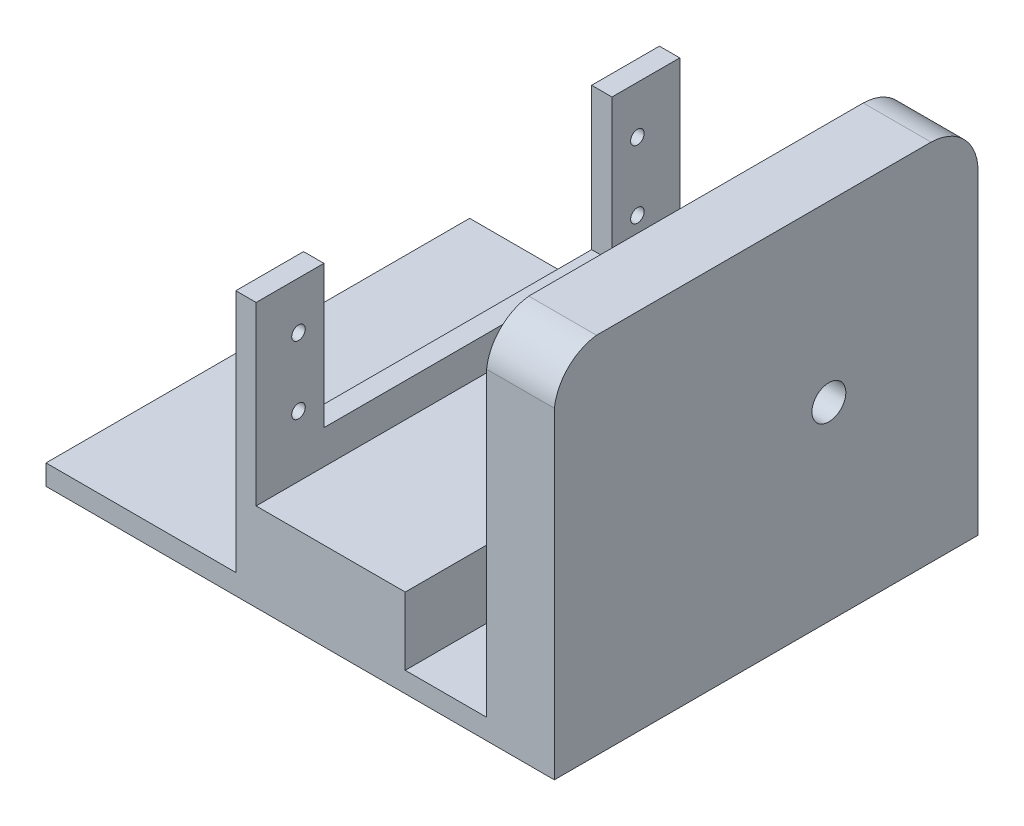
ISO-10303-21;
HEADER;
FILE_DESCRIPTION(('STEP AP214'),'2;1');
FILE_NAME('part.step','',(''),(''),'','','');
FILE_SCHEMA(('AUTOMOTIVE_DESIGN { 1 0 10303 214 1 1 1 1 }'));
ENDSEC;
DATA;
#1=APPLICATION_CONTEXT('core data for automotive mechanical design processes');
#2=APPLICATION_PROTOCOL_DEFINITION('international standard','automotive_design',2000,#1);
#3=PRODUCT_CONTEXT('',#1,'mechanical');
#4=PRODUCT('Part','Part','',(#3));
#5=PRODUCT_RELATED_PRODUCT_CATEGORY('part','',(#4));
#6=PRODUCT_DEFINITION_FORMATION('','',#4);
#7=PRODUCT_DEFINITION_CONTEXT('part definition',#1,'design');
#8=PRODUCT_DEFINITION('design','',#6,#7);
#9=PRODUCT_DEFINITION_SHAPE('','',#8);
#10=(LENGTH_UNIT() NAMED_UNIT(*) SI_UNIT(.MILLI.,.METRE.));
#11=(NAMED_UNIT(*) PLANE_ANGLE_UNIT() SI_UNIT($,.RADIAN.));
#12=(NAMED_UNIT(*) SI_UNIT($,.STERADIAN.) SOLID_ANGLE_UNIT());
#13=UNCERTAINTY_MEASURE_WITH_UNIT(LENGTH_MEASURE(1.E-05),#10,'distance_accuracy_value','');
#14=(GEOMETRIC_REPRESENTATION_CONTEXT(3) GLOBAL_UNCERTAINTY_ASSIGNED_CONTEXT((#13)) GLOBAL_UNIT_ASSIGNED_CONTEXT((#10,
#11,#12)) REPRESENTATION_CONTEXT('',''));
#15=CARTESIAN_POINT('',(0.,0.,0.));
#16=DIRECTION('',(0.,0.,1.));
#17=DIRECTION('',(1.,0.,0.));
#18=AXIS2_PLACEMENT_3D('',#15,#16,#17);
#19=CARTESIAN_POINT('',(99.,53.7,0.));
#20=DIRECTION('',(-1.,0.,0.));
#21=DIRECTION('',(0.,0.,1.));
#22=AXIS2_PLACEMENT_3D('',#19,#20,#21);
#23=PLANE('',#22);
#24=CARTESIAN_POINT('',(99.,28.,-40.5));
#25=DIRECTION('',(1.,0.,0.));
#26=DIRECTION('',(0.,0.,-1.));
#27=AXIS2_PLACEMENT_3D('',#24,#25,#26);
#28=CIRCLE('',#27,2.5);
#29=CARTESIAN_POINT('',(99.,28.,-43.));
#30=VERTEX_POINT('',#29);
#31=EDGE_CURVE('E189',#30,#30,#28,.T.);
#32=ORIENTED_EDGE('',*,*,#31,.F.);
#33=EDGE_LOOP('',(#32));
#34=FACE_BOUND('',#33,.T.);
#35=DIRECTION('',(0.,0.,-1.));
#36=VECTOR('',#35,1.);
#37=CARTESIAN_POINT('',(99.,53.7,0.));
#38=LINE('',#37,#36);
#39=CARTESIAN_POINT('',(99.,53.7,-6.2188127706575));
#40=VERTEX_POINT('',#39);
#41=CARTESIAN_POINT('',(99.,53.7,-55.5690833949978));
#42=VERTEX_POINT('',#41);
#43=EDGE_CURVE('E174',#40,#42,#38,.T.);
#44=ORIENTED_EDGE('',*,*,#43,.F.);
#45=CARTESIAN_POINT('',(99.,46.6229024406769,-7.07709755932307));
#46=DIRECTION('',(1.,0.,0.));
#47=DIRECTION('',(0.,0.,-1.));
#48=AXIS2_PLACEMENT_3D('',#45,#46,#47);
#49=CIRCLE('',#48,7.12895242252543);
#50=CARTESIAN_POINT('',(99.,47.4811872293424,0.));
#51=VERTEX_POINT('',#50);
#52=EDGE_CURVE('E161',#51,#40,#49,.F.);
#53=ORIENTED_EDGE('',*,*,#52,.F.);
#54=DIRECTION('',(0.,-1.,0.));
#55=VECTOR('',#54,1.);
#56=CARTESIAN_POINT('',(99.,53.7,0.));
#57=LINE('',#56,#55);
#58=CARTESIAN_POINT('',(99.,0.,0.));
#59=VERTEX_POINT('',#58);
#60=EDGE_CURVE('E170',#51,#59,#57,.T.);
#61=ORIENTED_EDGE('',*,*,#60,.T.);
#62=DIRECTION('',(0.,0.,-1.));
#63=VECTOR('',#62,1.);
#64=CARTESIAN_POINT('',(99.,0.,0.));
#65=LINE('',#64,#63);
#66=CARTESIAN_POINT('',(99.,0.,-62.5));
#67=VERTEX_POINT('',#66);
#68=EDGE_CURVE('E328',#59,#67,#65,.T.);
#69=ORIENTED_EDGE('',*,*,#68,.T.);
#70=DIRECTION('',(0.,-1.,0.));
#71=VECTOR('',#70,1.);
#72=CARTESIAN_POINT('',(99.,53.7,-62.5));
#73=LINE('',#72,#71);
#74=CARTESIAN_POINT('',(99.,46.6229024406769,-62.5));
#75=VERTEX_POINT('',#74);
#76=EDGE_CURVE('E181',#75,#67,#73,.T.);
#77=ORIENTED_EDGE('',*,*,#76,.F.);
#78=CARTESIAN_POINT('',(99.,46.6215697941753,-55.42000012542));
#79=DIRECTION('',(1.,0.,0.));
#80=DIRECTION('',(0.,0.,-1.));
#81=AXIS2_PLACEMENT_3D('',#78,#79,#80);
#82=CIRCLE('',#81,7.08);
#83=EDGE_CURVE('E175',#75,#42,#82,.T.);
#84=ORIENTED_EDGE('',*,*,#83,.T.);
#85=EDGE_LOOP('',(#44,#53,#61,#69,#77,#84));
#86=FACE_BOUND('',#85,.T.);
#87=ADVANCED_FACE('F36',(#34,#86),#23,.F.);
#88=CARTESIAN_POINT('',(0.,53.7,-62.5));
#89=DIRECTION('',(0.,-1.,0.));
#90=DIRECTION('',(0.,0.,-1.));
#91=AXIS2_PLACEMENT_3D('',#88,#89,#90);
#92=PLANE('',#91);
#93=DIRECTION('',(0.,0.,-1.));
#94=VECTOR('',#93,1.);
#95=CARTESIAN_POINT('',(89.,53.7,-62.5));
#96=LINE('',#95,#94);
#97=CARTESIAN_POINT('',(89.,53.7,-6.21881277065751));
#98=VERTEX_POINT('',#97);
#99=CARTESIAN_POINT('',(89.,53.7,-55.5690833949978));
#100=VERTEX_POINT('',#99);
#101=EDGE_CURVE('E308',#98,#100,#96,.T.);
#102=ORIENTED_EDGE('',*,*,#101,.F.);
#103=DIRECTION('',(1.,0.,0.));
#104=VECTOR('',#103,1.);
#105=CARTESIAN_POINT('',(49.,53.7,-6.2188127706575));
#106=LINE('',#105,#104);
#107=EDGE_CURVE('E59',#98,#40,#106,.T.);
#108=ORIENTED_EDGE('',*,*,#107,.T.);
#109=ORIENTED_EDGE('',*,*,#43,.T.);
#110=DIRECTION('',(1.,0.,0.));
#111=VECTOR('',#110,1.);
#112=CARTESIAN_POINT('',(49.,53.7,-55.5690833949978));
#113=LINE('',#112,#111);
#114=EDGE_CURVE('E376',#100,#42,#113,.T.);
#115=ORIENTED_EDGE('',*,*,#114,.F.);
#116=EDGE_LOOP('',(#102,#108,#109,#115));
#117=FACE_BOUND('',#116,.T.);
#118=ADVANCED_FACE('F378',(#117),#92,.F.);
#119=CARTESIAN_POINT('',(89.,3.,-62.5));
#120=DIRECTION('',(1.,0.,0.));
#121=DIRECTION('',(0.,0.,-1.));
#122=AXIS2_PLACEMENT_3D('',#119,#120,#121);
#123=PLANE('',#122);
#124=CARTESIAN_POINT('',(89.,28.,-40.5));
#125=DIRECTION('',(1.,0.,0.));
#126=DIRECTION('',(0.,0.,-1.));
#127=AXIS2_PLACEMENT_3D('',#124,#125,#126);
#128=CIRCLE('',#127,2.5);
#129=CARTESIAN_POINT('',(89.,28.,-43.));
#130=VERTEX_POINT('',#129);
#131=EDGE_CURVE('E186',#130,#130,#128,.T.);
#132=ORIENTED_EDGE('',*,*,#131,.T.);
#133=EDGE_LOOP('',(#132));
#134=FACE_BOUND('',#133,.T.);
#135=DIRECTION('',(0.,1.,0.));
#136=VECTOR('',#135,1.);
#137=CARTESIAN_POINT('',(89.,3.,0.));
#138=LINE('',#137,#136);
#139=CARTESIAN_POINT('',(89.,3.,0.));
#140=VERTEX_POINT('',#139);
#141=CARTESIAN_POINT('',(89.,47.4811872293424,0.));
#142=VERTEX_POINT('',#141);
#143=EDGE_CURVE('E318',#140,#142,#138,.T.);
#144=ORIENTED_EDGE('',*,*,#143,.T.);
#145=CARTESIAN_POINT('',(89.,46.6229024406769,-7.07709755932307));
#146=DIRECTION('',(1.,0.,0.));
#147=DIRECTION('',(0.,0.,-1.));
#148=AXIS2_PLACEMENT_3D('',#145,#146,#147);
#149=CIRCLE('',#148,7.12895242252543);
#150=EDGE_CURVE('E11',#142,#98,#149,.F.);
#151=ORIENTED_EDGE('',*,*,#150,.T.);
#152=ORIENTED_EDGE('',*,*,#101,.T.);
#153=CARTESIAN_POINT('',(89.,46.6215697941753,-55.42000012542));
#154=DIRECTION('',(1.,0.,0.));
#155=DIRECTION('',(0.,0.,-1.));
#156=AXIS2_PLACEMENT_3D('',#153,#154,#155);
#157=CIRCLE('',#156,7.08);
#158=CARTESIAN_POINT('',(89.,46.6229024406769,-62.5));
#159=VERTEX_POINT('',#158);
#160=EDGE_CURVE('E44',#159,#100,#157,.T.);
#161=ORIENTED_EDGE('',*,*,#160,.F.);
#162=DIRECTION('',(0.,1.,0.));
#163=VECTOR('',#162,1.);
#164=CARTESIAN_POINT('',(89.,3.,-62.5));
#165=LINE('',#164,#163);
#166=CARTESIAN_POINT('',(89.,3.,-62.5));
#167=VERTEX_POINT('',#166);
#168=EDGE_CURVE('E321',#167,#159,#165,.T.);
#169=ORIENTED_EDGE('',*,*,#168,.F.);
#170=DIRECTION('',(0.,0.,-1.));
#171=VECTOR('',#170,1.);
#172=CARTESIAN_POINT('',(89.,3.,-62.5));
#173=LINE('',#172,#171);
#174=EDGE_CURVE('E311',#140,#167,#173,.T.);
#175=ORIENTED_EDGE('',*,*,#174,.F.);
#176=EDGE_LOOP('',(#144,#151,#152,#161,#169,#175));
#177=FACE_BOUND('',#176,.T.);
#178=ADVANCED_FACE('F372',(#134,#177),#123,.F.);
#179=CARTESIAN_POINT('',(10.,3.,0.));
#180=DIRECTION('',(0.,1.,0.));
#181=DIRECTION('',(0.,0.,1.));
#182=AXIS2_PLACEMENT_3D('',#179,#180,#181);
#183=PLANE('',#182);
#184=DIRECTION('',(-1.,0.,0.));
#185=VECTOR('',#184,1.);
#186=CARTESIAN_POINT('',(9.99999999999999,3.,-62.5));
#187=LINE('',#186,#185);
#188=CARTESIAN_POINT('',(77.,3.,-62.5));
#189=VERTEX_POINT('',#188);
#190=EDGE_CURVE('E316',#167,#189,#187,.T.);
#191=ORIENTED_EDGE('',*,*,#190,.T.);
#192=DIRECTION('',(0.,0.,-1.));
#193=VECTOR('',#192,1.);
#194=CARTESIAN_POINT('',(77.,3.,-62.5));
#195=LINE('',#194,#193);
#196=CARTESIAN_POINT('',(77.,3.,0.));
#197=VERTEX_POINT('',#196);
#198=EDGE_CURVE('E273',#197,#189,#195,.T.);
#199=ORIENTED_EDGE('',*,*,#198,.F.);
#200=DIRECTION('',(1.,0.,0.));
#201=VECTOR('',#200,1.);
#202=CARTESIAN_POINT('',(10.,3.,0.));
#203=LINE('',#202,#201);
#204=EDGE_CURVE('E312',#197,#140,#203,.T.);
#205=ORIENTED_EDGE('',*,*,#204,.T.);
#206=ORIENTED_EDGE('',*,*,#174,.T.);
#207=EDGE_LOOP('',(#191,#199,#205,#206));
#208=FACE_BOUND('',#207,.T.);
#209=ADVANCED_FACE('F369',(#208),#183,.T.);
#210=DIRECTION('',(0.,0.,-1.));
#211=VECTOR('',#210,1.);
#212=CARTESIAN_POINT('',(24.,3.,0.));
#213=LINE('',#212,#211);
#214=CARTESIAN_POINT('',(24.,3.,0.));
#215=VERTEX_POINT('',#214);
#216=CARTESIAN_POINT('',(24.,3.,-62.5));
#217=VERTEX_POINT('',#216);
#218=EDGE_CURVE('E228',#215,#217,#213,.T.);
#219=ORIENTED_EDGE('',*,*,#218,.F.);
#220=CARTESIAN_POINT('',(52.,3.,0.));
#221=VERTEX_POINT('',#220);
#222=EDGE_CURVE('E309',#215,#221,#203,.T.);
#223=ORIENTED_EDGE('',*,*,#222,.T.);
#224=DIRECTION('',(0.,0.,1.));
#225=VECTOR('',#224,1.);
#226=CARTESIAN_POINT('',(52.,3.,-62.5));
#227=LINE('',#226,#225);
#228=CARTESIAN_POINT('',(52.,3.,-62.5));
#229=VERTEX_POINT('',#228);
#230=EDGE_CURVE('E288',#229,#221,#227,.T.);
#231=ORIENTED_EDGE('',*,*,#230,.F.);
#232=EDGE_CURVE('E315',#229,#217,#187,.T.);
#233=ORIENTED_EDGE('',*,*,#232,.T.);
#234=EDGE_LOOP('',(#219,#223,#231,#233));
#235=FACE_BOUND('',#234,.T.);
#236=ADVANCED_FACE('F345',(#235),#183,.T.);
#237=CARTESIAN_POINT('',(0.,53.7,0.));
#238=DIRECTION('',(0.,0.,-1.));
#239=DIRECTION('',(-1.,0.,0.));
#240=AXIS2_PLACEMENT_3D('',#237,#238,#239);
#241=PLANE('',#240);
#242=ORIENTED_EDGE('',*,*,#60,.F.);
#243=DIRECTION('',(1.,0.,0.));
#244=VECTOR('',#243,1.);
#245=CARTESIAN_POINT('',(49.,47.4811872293424,0.));
#246=LINE('',#245,#244);
#247=EDGE_CURVE('E158',#142,#51,#246,.T.);
#248=ORIENTED_EDGE('',*,*,#247,.F.);
#249=ORIENTED_EDGE('',*,*,#143,.F.);
#250=ORIENTED_EDGE('',*,*,#204,.F.);
#251=DIRECTION('',(0.,-1.,0.));
#252=VECTOR('',#251,1.);
#253=CARTESIAN_POINT('',(77.,13.,0.));
#254=LINE('',#253,#252);
#255=CARTESIAN_POINT('',(77.,13.,0.));
#256=VERTEX_POINT('',#255);
#257=EDGE_CURVE('E292',#256,#197,#254,.T.);
#258=ORIENTED_EDGE('',*,*,#257,.F.);
#259=DIRECTION('',(1.,0.,0.));
#260=VECTOR('',#259,1.);
#261=CARTESIAN_POINT('',(77.,13.,0.));
#262=LINE('',#261,#260);
#263=CARTESIAN_POINT('',(55.,13.,0.));
#264=VERTEX_POINT('',#263);
#265=EDGE_CURVE('E290',#264,#256,#262,.T.);
#266=ORIENTED_EDGE('',*,*,#265,.F.);
#267=DIRECTION('',(0.,1.,0.));
#268=VECTOR('',#267,1.);
#269=CARTESIAN_POINT('',(55.,39.,0.));
#270=LINE('',#269,#268);
#271=CARTESIAN_POINT('',(55.,39.,0.));
#272=VERTEX_POINT('',#271);
#273=EDGE_CURVE('E234',#264,#272,#270,.T.);
#274=ORIENTED_EDGE('',*,*,#273,.T.);
#275=DIRECTION('',(-1.,0.,0.));
#276=VECTOR('',#275,1.);
#277=CARTESIAN_POINT('',(55.,39.,0.));
#278=LINE('',#277,#276);
#279=CARTESIAN_POINT('',(52.,39.,0.));
#280=VERTEX_POINT('',#279);
#281=EDGE_CURVE('E256',#272,#280,#278,.T.);
#282=ORIENTED_EDGE('',*,*,#281,.T.);
#283=DIRECTION('',(0.,-1.,0.));
#284=VECTOR('',#283,1.);
#285=CARTESIAN_POINT('',(52.,13.,0.));
#286=LINE('',#285,#284);
#287=EDGE_CURVE('E299',#280,#221,#286,.T.);
#288=ORIENTED_EDGE('',*,*,#287,.T.);
#289=ORIENTED_EDGE('',*,*,#222,.F.);
#290=DIRECTION('',(0.,-1.,0.));
#291=VECTOR('',#290,1.);
#292=CARTESIAN_POINT('',(24.,72.,0.));
#293=LINE('',#292,#291);
#294=CARTESIAN_POINT('',(24.,0.,0.));
#295=VERTEX_POINT('',#294);
#296=EDGE_CURVE('E226',#215,#295,#293,.T.);
#297=ORIENTED_EDGE('',*,*,#296,.T.);
#298=DIRECTION('',(1.,0.,0.));
#299=VECTOR('',#298,1.);
#300=CARTESIAN_POINT('',(0.,0.,0.));
#301=LINE('',#300,#299);
#302=EDGE_CURVE('E179',#295,#59,#301,.T.);
#303=ORIENTED_EDGE('',*,*,#302,.T.);
#304=EDGE_LOOP('',(#242,#248,#249,#250,#258,#266,#274,#282,#288,#289,#297,#303));
#305=FACE_BOUND('',#304,.T.);
#306=ADVANCED_FACE('F38',(#305),#241,.F.);
#307=CARTESIAN_POINT('',(0.,53.7,-62.5));
#308=DIRECTION('',(0.,0.,1.));
#309=DIRECTION('',(1.,0.,0.));
#310=AXIS2_PLACEMENT_3D('',#307,#308,#309);
#311=PLANE('',#310);
#312=ORIENTED_EDGE('',*,*,#168,.T.);
#313=DIRECTION('',(1.,0.,0.));
#314=VECTOR('',#313,1.);
#315=CARTESIAN_POINT('',(49.,46.6229024406769,-62.5));
#316=LINE('',#315,#314);
#317=EDGE_CURVE('E51',#159,#75,#316,.T.);
#318=ORIENTED_EDGE('',*,*,#317,.T.);
#319=ORIENTED_EDGE('',*,*,#76,.T.);
#320=DIRECTION('',(-1.,0.,0.));
#321=VECTOR('',#320,1.);
#322=CARTESIAN_POINT('',(0.,0.,-62.5));
#323=LINE('',#322,#321);
#324=CARTESIAN_POINT('',(24.,0.,-62.5));
#325=VERTEX_POINT('',#324);
#326=EDGE_CURVE('E326',#67,#325,#323,.T.);
#327=ORIENTED_EDGE('',*,*,#326,.T.);
#328=DIRECTION('',(0.,-1.,0.));
#329=VECTOR('',#328,1.);
#330=CARTESIAN_POINT('',(24.,72.,-62.5));
#331=LINE('',#330,#329);
#332=EDGE_CURVE('E225',#217,#325,#331,.T.);
#333=ORIENTED_EDGE('',*,*,#332,.F.);
#334=ORIENTED_EDGE('',*,*,#232,.F.);
#335=DIRECTION('',(0.,-1.,0.));
#336=VECTOR('',#335,1.);
#337=CARTESIAN_POINT('',(52.,13.,-62.5));
#338=LINE('',#337,#336);
#339=CARTESIAN_POINT('',(52.,39.,-62.5));
#340=VERTEX_POINT('',#339);
#341=EDGE_CURVE('E302',#340,#229,#338,.T.);
#342=ORIENTED_EDGE('',*,*,#341,.F.);
#343=DIRECTION('',(-1.,0.,0.));
#344=VECTOR('',#343,1.);
#345=CARTESIAN_POINT('',(55.,39.,-62.5));
#346=LINE('',#345,#344);
#347=CARTESIAN_POINT('',(55.,39.,-62.5));
#348=VERTEX_POINT('',#347);
#349=EDGE_CURVE('E270',#348,#340,#346,.T.);
#350=ORIENTED_EDGE('',*,*,#349,.F.);
#351=DIRECTION('',(0.,-1.,0.));
#352=VECTOR('',#351,1.);
#353=CARTESIAN_POINT('',(55.,13.,-62.5));
#354=LINE('',#353,#352);
#355=CARTESIAN_POINT('',(55.,13.,-62.5));
#356=VERTEX_POINT('',#355);
#357=EDGE_CURVE('E253',#348,#356,#354,.T.);
#358=ORIENTED_EDGE('',*,*,#357,.T.);
#359=DIRECTION('',(-1.,0.,0.));
#360=VECTOR('',#359,1.);
#361=CARTESIAN_POINT('',(77.,13.,-62.5));
#362=LINE('',#361,#360);
#363=CARTESIAN_POINT('',(77.,13.,-62.5));
#364=VERTEX_POINT('',#363);
#365=EDGE_CURVE('E287',#364,#356,#362,.T.);
#366=ORIENTED_EDGE('',*,*,#365,.F.);
#367=DIRECTION('',(0.,-1.,0.));
#368=VECTOR('',#367,1.);
#369=CARTESIAN_POINT('',(77.,13.,-62.5));
#370=LINE('',#369,#368);
#371=EDGE_CURVE('E305',#364,#189,#370,.T.);
#372=ORIENTED_EDGE('',*,*,#371,.T.);
#373=ORIENTED_EDGE('',*,*,#190,.F.);
#374=EDGE_LOOP('',(#312,#318,#319,#327,#333,#334,#342,#350,#358,#366,#372,#373));
#375=FACE_BOUND('',#374,.T.);
#376=ADVANCED_FACE('F333',(#375),#311,.F.);
#377=CARTESIAN_POINT('',(0.,0.,-62.5));
#378=DIRECTION('',(0.,-1.,0.));
#379=DIRECTION('',(0.,0.,-1.));
#380=AXIS2_PLACEMENT_3D('',#377,#378,#379);
#381=PLANE('',#380);
#382=DIRECTION('',(0.,0.,1.));
#383=VECTOR('',#382,1.);
#384=CARTESIAN_POINT('',(24.,0.,0.));
#385=LINE('',#384,#383);
#386=EDGE_CURVE('E221',#325,#295,#385,.T.);
#387=ORIENTED_EDGE('',*,*,#386,.F.);
#388=ORIENTED_EDGE('',*,*,#326,.F.);
#389=ORIENTED_EDGE('',*,*,#68,.F.);
#390=ORIENTED_EDGE('',*,*,#302,.F.);
#391=EDGE_LOOP('',(#387,#388,#389,#390));
#392=FACE_BOUND('',#391,.T.);
#393=ADVANCED_FACE('F339',(#392),#381,.T.);
#394=CARTESIAN_POINT('',(77.,13.,-62.5));
#395=DIRECTION('',(-1.,0.,0.));
#396=DIRECTION('',(0.,0.,1.));
#397=AXIS2_PLACEMENT_3D('',#394,#395,#396);
#398=PLANE('',#397);
#399=ORIENTED_EDGE('',*,*,#198,.T.);
#400=ORIENTED_EDGE('',*,*,#371,.F.);
#401=DIRECTION('',(0.,0.,-1.));
#402=VECTOR('',#401,1.);
#403=CARTESIAN_POINT('',(77.,13.,-62.5));
#404=LINE('',#403,#402);
#405=EDGE_CURVE('E284',#256,#364,#404,.T.);
#406=ORIENTED_EDGE('',*,*,#405,.F.);
#407=ORIENTED_EDGE('',*,*,#257,.T.);
#408=EDGE_LOOP('',(#399,#400,#406,#407));
#409=FACE_BOUND('',#408,.T.);
#410=ADVANCED_FACE('F366',(#409),#398,.F.);
#411=CARTESIAN_POINT('',(52.,13.,-62.5));
#412=DIRECTION('',(1.,0.,0.));
#413=DIRECTION('',(0.,0.,-1.));
#414=AXIS2_PLACEMENT_3D('',#411,#412,#413);
#415=PLANE('',#414);
#416=CARTESIAN_POINT('',(52.,32.,-6.25000000000001));
#417=DIRECTION('',(-1.,0.,0.));
#418=DIRECTION('',(0.,0.,1.));
#419=AXIS2_PLACEMENT_3D('',#416,#417,#418);
#420=CIRCLE('',#419,1.);
#421=CARTESIAN_POINT('',(52.,32.,-5.25000000000001));
#422=VERTEX_POINT('',#421);
#423=EDGE_CURVE('E188',#422,#422,#420,.T.);
#424=ORIENTED_EDGE('',*,*,#423,.F.);
#425=EDGE_LOOP('',(#424));
#426=FACE_BOUND('',#425,.T.);
#427=CARTESIAN_POINT('',(52.,22.,-6.25000000000001));
#428=DIRECTION('',(-1.,0.,0.));
#429=DIRECTION('',(0.,0.,1.));
#430=AXIS2_PLACEMENT_3D('',#427,#428,#429);
#431=CIRCLE('',#430,0.999999999999999);
#432=CARTESIAN_POINT('',(52.,22.,-5.25000000000001));
#433=VERTEX_POINT('',#432);
#434=EDGE_CURVE('E204',#433,#433,#431,.T.);
#435=ORIENTED_EDGE('',*,*,#434,.F.);
#436=EDGE_LOOP('',(#435));
#437=FACE_BOUND('',#436,.T.);
#438=CARTESIAN_POINT('',(52.,22.,-56.25));
#439=DIRECTION('',(-1.,0.,0.));
#440=DIRECTION('',(0.,0.,1.));
#441=AXIS2_PLACEMENT_3D('',#438,#439,#440);
#442=CIRCLE('',#441,0.999999999999998);
#443=CARTESIAN_POINT('',(52.,22.,-55.25));
#444=VERTEX_POINT('',#443);
#445=EDGE_CURVE('E209',#444,#444,#442,.T.);
#446=ORIENTED_EDGE('',*,*,#445,.F.);
#447=EDGE_LOOP('',(#446));
#448=FACE_BOUND('',#447,.T.);
#449=CARTESIAN_POINT('',(52.,32.,-56.25));
#450=DIRECTION('',(-1.,0.,0.));
#451=DIRECTION('',(0.,0.,1.));
#452=AXIS2_PLACEMENT_3D('',#449,#450,#451);
#453=CIRCLE('',#452,0.999999999999998);
#454=CARTESIAN_POINT('',(52.,32.,-55.25));
#455=VERTEX_POINT('',#454);
#456=EDGE_CURVE('E215',#455,#455,#453,.T.);
#457=ORIENTED_EDGE('',*,*,#456,.F.);
#458=EDGE_LOOP('',(#457));
#459=FACE_BOUND('',#458,.T.);
#460=ORIENTED_EDGE('',*,*,#230,.T.);
#461=ORIENTED_EDGE('',*,*,#287,.F.);
#462=DIRECTION('',(0.,0.,-1.));
#463=VECTOR('',#462,1.);
#464=CARTESIAN_POINT('',(52.,39.,-10.));
#465=LINE('',#464,#463);
#466=CARTESIAN_POINT('',(52.,39.,-10.));
#467=VERTEX_POINT('',#466);
#468=EDGE_CURVE('E231',#280,#467,#465,.T.);
#469=ORIENTED_EDGE('',*,*,#468,.T.);
#470=DIRECTION('',(0.,-1.,0.));
#471=VECTOR('',#470,1.);
#472=CARTESIAN_POINT('',(52.,18.,-10.));
#473=LINE('',#472,#471);
#474=CARTESIAN_POINT('',(52.,18.,-10.));
#475=VERTEX_POINT('',#474);
#476=EDGE_CURVE('E259',#467,#475,#473,.T.);
#477=ORIENTED_EDGE('',*,*,#476,.T.);
#478=DIRECTION('',(0.,0.,-1.));
#479=VECTOR('',#478,1.);
#480=CARTESIAN_POINT('',(52.,18.,-52.5));
#481=LINE('',#480,#479);
#482=CARTESIAN_POINT('',(52.,18.,-52.5));
#483=VERTEX_POINT('',#482);
#484=EDGE_CURVE('E262',#475,#483,#481,.T.);
#485=ORIENTED_EDGE('',*,*,#484,.T.);
#486=DIRECTION('',(0.,1.,0.));
#487=VECTOR('',#486,1.);
#488=CARTESIAN_POINT('',(52.,39.,-52.5));
#489=LINE('',#488,#487);
#490=CARTESIAN_POINT('',(52.,39.,-52.5));
#491=VERTEX_POINT('',#490);
#492=EDGE_CURVE('E265',#483,#491,#489,.T.);
#493=ORIENTED_EDGE('',*,*,#492,.T.);
#494=DIRECTION('',(0.,0.,-1.));
#495=VECTOR('',#494,1.);
#496=CARTESIAN_POINT('',(52.,39.,-62.5));
#497=LINE('',#496,#495);
#498=EDGE_CURVE('E235',#491,#340,#497,.T.);
#499=ORIENTED_EDGE('',*,*,#498,.T.);
#500=ORIENTED_EDGE('',*,*,#341,.T.);
#501=EDGE_LOOP('',(#460,#461,#469,#477,#485,#493,#499,#500));
#502=FACE_BOUND('',#501,.T.);
#503=ADVANCED_FACE('F347',(#426,#437,#448,#459,#502),#415,.F.);
#504=CARTESIAN_POINT('',(77.,13.,0.));
#505=DIRECTION('',(0.,-1.,0.));
#506=DIRECTION('',(0.,0.,-1.));
#507=AXIS2_PLACEMENT_3D('',#504,#505,#506);
#508=PLANE('',#507);
#509=ORIENTED_EDGE('',*,*,#365,.T.);
#510=DIRECTION('',(0.,0.,1.));
#511=VECTOR('',#510,1.);
#512=CARTESIAN_POINT('',(55.,13.,0.));
#513=LINE('',#512,#511);
#514=EDGE_CURVE('E232',#356,#264,#513,.T.);
#515=ORIENTED_EDGE('',*,*,#514,.T.);
#516=ORIENTED_EDGE('',*,*,#265,.T.);
#517=ORIENTED_EDGE('',*,*,#405,.T.);
#518=EDGE_LOOP('',(#509,#515,#516,#517));
#519=FACE_BOUND('',#518,.T.);
#520=ADVANCED_FACE('F362',(#519),#508,.F.);
#521=CARTESIAN_POINT('',(55.,39.,-62.5));
#522=DIRECTION('',(0.,1.,0.));
#523=DIRECTION('',(0.,0.,1.));
#524=AXIS2_PLACEMENT_3D('',#521,#522,#523);
#525=PLANE('',#524);
#526=ORIENTED_EDGE('',*,*,#498,.F.);
#527=DIRECTION('',(-1.,0.,0.));
#528=VECTOR('',#527,1.);
#529=CARTESIAN_POINT('',(55.,39.,-52.5));
#530=LINE('',#529,#528);
#531=CARTESIAN_POINT('',(55.,39.,-52.5));
#532=VERTEX_POINT('',#531);
#533=EDGE_CURVE('E274',#532,#491,#530,.T.);
#534=ORIENTED_EDGE('',*,*,#533,.F.);
#535=DIRECTION('',(0.,0.,-1.));
#536=VECTOR('',#535,1.);
#537=CARTESIAN_POINT('',(55.,39.,-62.5));
#538=LINE('',#537,#536);
#539=EDGE_CURVE('E250',#532,#348,#538,.T.);
#540=ORIENTED_EDGE('',*,*,#539,.T.);
#541=ORIENTED_EDGE('',*,*,#349,.T.);
#542=EDGE_LOOP('',(#526,#534,#540,#541));
#543=FACE_BOUND('',#542,.T.);
#544=ADVANCED_FACE('F350',(#543),#525,.T.);
#545=CARTESIAN_POINT('',(55.,39.,-52.5));
#546=DIRECTION('',(0.,0.,1.));
#547=DIRECTION('',(0.,-1.,0.));
#548=AXIS2_PLACEMENT_3D('',#545,#546,#547);
#549=PLANE('',#548);
#550=ORIENTED_EDGE('',*,*,#492,.F.);
#551=DIRECTION('',(-1.,0.,0.));
#552=VECTOR('',#551,1.);
#553=CARTESIAN_POINT('',(55.,18.,-52.5));
#554=LINE('',#553,#552);
#555=CARTESIAN_POINT('',(55.,18.,-52.5));
#556=VERTEX_POINT('',#555);
#557=EDGE_CURVE('E276',#556,#483,#554,.T.);
#558=ORIENTED_EDGE('',*,*,#557,.F.);
#559=DIRECTION('',(0.,1.,0.));
#560=VECTOR('',#559,1.);
#561=CARTESIAN_POINT('',(55.,39.,-52.5));
#562=LINE('',#561,#560);
#563=EDGE_CURVE('E247',#556,#532,#562,.T.);
#564=ORIENTED_EDGE('',*,*,#563,.T.);
#565=ORIENTED_EDGE('',*,*,#533,.T.);
#566=EDGE_LOOP('',(#550,#558,#564,#565));
#567=FACE_BOUND('',#566,.T.);
#568=ADVANCED_FACE('F421',(#567),#549,.T.);
#569=CARTESIAN_POINT('',(55.,18.,-52.5));
#570=DIRECTION('',(0.,1.,0.));
#571=DIRECTION('',(0.,0.,1.));
#572=AXIS2_PLACEMENT_3D('',#569,#570,#571);
#573=PLANE('',#572);
#574=ORIENTED_EDGE('',*,*,#484,.F.);
#575=DIRECTION('',(-1.,0.,0.));
#576=VECTOR('',#575,1.);
#577=CARTESIAN_POINT('',(55.,18.,-10.));
#578=LINE('',#577,#576);
#579=CARTESIAN_POINT('',(55.,18.,-10.));
#580=VERTEX_POINT('',#579);
#581=EDGE_CURVE('E278',#580,#475,#578,.T.);
#582=ORIENTED_EDGE('',*,*,#581,.F.);
#583=DIRECTION('',(0.,0.,-1.));
#584=VECTOR('',#583,1.);
#585=CARTESIAN_POINT('',(55.,18.,-52.5));
#586=LINE('',#585,#584);
#587=EDGE_CURVE('E244',#580,#556,#586,.T.);
#588=ORIENTED_EDGE('',*,*,#587,.T.);
#589=ORIENTED_EDGE('',*,*,#557,.T.);
#590=EDGE_LOOP('',(#574,#582,#588,#589));
#591=FACE_BOUND('',#590,.T.);
#592=ADVANCED_FACE('F417',(#591),#573,.T.);
#593=CARTESIAN_POINT('',(55.,18.,-10.));
#594=DIRECTION('',(0.,0.,-1.));
#595=DIRECTION('',(-1.,0.,0.));
#596=AXIS2_PLACEMENT_3D('',#593,#594,#595);
#597=PLANE('',#596);
#598=ORIENTED_EDGE('',*,*,#476,.F.);
#599=DIRECTION('',(-1.,0.,0.));
#600=VECTOR('',#599,1.);
#601=CARTESIAN_POINT('',(55.,39.,-10.));
#602=LINE('',#601,#600);
#603=CARTESIAN_POINT('',(55.,39.,-10.));
#604=VERTEX_POINT('',#603);
#605=EDGE_CURVE('E280',#604,#467,#602,.T.);
#606=ORIENTED_EDGE('',*,*,#605,.F.);
#607=DIRECTION('',(0.,-1.,0.));
#608=VECTOR('',#607,1.);
#609=CARTESIAN_POINT('',(55.,18.,-10.));
#610=LINE('',#609,#608);
#611=EDGE_CURVE('E241',#604,#580,#610,.T.);
#612=ORIENTED_EDGE('',*,*,#611,.T.);
#613=ORIENTED_EDGE('',*,*,#581,.T.);
#614=EDGE_LOOP('',(#598,#606,#612,#613));
#615=FACE_BOUND('',#614,.T.);
#616=ADVANCED_FACE('F413',(#615),#597,.T.);
#617=CARTESIAN_POINT('',(55.,39.,-10.));
#618=DIRECTION('',(0.,1.,0.));
#619=DIRECTION('',(0.,0.,1.));
#620=AXIS2_PLACEMENT_3D('',#617,#618,#619);
#621=PLANE('',#620);
#622=ORIENTED_EDGE('',*,*,#468,.F.);
#623=ORIENTED_EDGE('',*,*,#281,.F.);
#624=DIRECTION('',(0.,0.,-1.));
#625=VECTOR('',#624,1.);
#626=CARTESIAN_POINT('',(55.,39.,-10.));
#627=LINE('',#626,#625);
#628=EDGE_CURVE('E238',#272,#604,#627,.T.);
#629=ORIENTED_EDGE('',*,*,#628,.T.);
#630=ORIENTED_EDGE('',*,*,#605,.T.);
#631=EDGE_LOOP('',(#622,#623,#629,#630));
#632=FACE_BOUND('',#631,.T.);
#633=ADVANCED_FACE('F410',(#632),#621,.T.);
#634=CARTESIAN_POINT('',(55.,13.,-62.5));
#635=DIRECTION('',(1.,0.,0.));
#636=DIRECTION('',(0.,0.,-1.));
#637=AXIS2_PLACEMENT_3D('',#634,#635,#636);
#638=PLANE('',#637);
#639=CARTESIAN_POINT('',(55.,32.,-6.25000000000001));
#640=DIRECTION('',(1.,0.,0.));
#641=DIRECTION('',(0.,0.,-1.));
#642=AXIS2_PLACEMENT_3D('',#639,#640,#641);
#643=CIRCLE('',#642,1.);
#644=CARTESIAN_POINT('',(55.,32.,-5.25000000000001));
#645=VERTEX_POINT('',#644);
#646=EDGE_CURVE('E193',#645,#645,#643,.F.);
#647=ORIENTED_EDGE('',*,*,#646,.T.);
#648=EDGE_LOOP('',(#647));
#649=FACE_BOUND('',#648,.T.);
#650=CARTESIAN_POINT('',(55.,22.,-6.25000000000001));
#651=DIRECTION('',(1.,0.,0.));
#652=DIRECTION('',(0.,0.,-1.));
#653=AXIS2_PLACEMENT_3D('',#650,#651,#652);
#654=CIRCLE('',#653,0.999999999999999);
#655=CARTESIAN_POINT('',(55.,22.,-5.25000000000001));
#656=VERTEX_POINT('',#655);
#657=EDGE_CURVE('E206',#656,#656,#654,.F.);
#658=ORIENTED_EDGE('',*,*,#657,.T.);
#659=EDGE_LOOP('',(#658));
#660=FACE_BOUND('',#659,.T.);
#661=CARTESIAN_POINT('',(55.,22.,-56.25));
#662=DIRECTION('',(1.,0.,0.));
#663=DIRECTION('',(0.,0.,-1.));
#664=AXIS2_PLACEMENT_3D('',#661,#662,#663);
#665=CIRCLE('',#664,0.999999999999998);
#666=CARTESIAN_POINT('',(55.,22.,-55.25));
#667=VERTEX_POINT('',#666);
#668=EDGE_CURVE('E212',#667,#667,#665,.F.);
#669=ORIENTED_EDGE('',*,*,#668,.T.);
#670=EDGE_LOOP('',(#669));
#671=FACE_BOUND('',#670,.T.);
#672=CARTESIAN_POINT('',(55.,32.,-56.25));
#673=DIRECTION('',(1.,0.,0.));
#674=DIRECTION('',(0.,0.,-1.));
#675=AXIS2_PLACEMENT_3D('',#672,#673,#674);
#676=CIRCLE('',#675,0.999999999999998);
#677=CARTESIAN_POINT('',(55.,32.,-55.25));
#678=VERTEX_POINT('',#677);
#679=EDGE_CURVE('E218',#678,#678,#676,.F.);
#680=ORIENTED_EDGE('',*,*,#679,.T.);
#681=EDGE_LOOP('',(#680));
#682=FACE_BOUND('',#681,.T.);
#683=ORIENTED_EDGE('',*,*,#514,.F.);
#684=ORIENTED_EDGE('',*,*,#357,.F.);
#685=ORIENTED_EDGE('',*,*,#539,.F.);
#686=ORIENTED_EDGE('',*,*,#563,.F.);
#687=ORIENTED_EDGE('',*,*,#587,.F.);
#688=ORIENTED_EDGE('',*,*,#611,.F.);
#689=ORIENTED_EDGE('',*,*,#628,.F.);
#690=ORIENTED_EDGE('',*,*,#273,.F.);
#691=EDGE_LOOP('',(#683,#684,#685,#686,#687,#688,#689,#690));
#692=FACE_BOUND('',#691,.T.);
#693=ADVANCED_FACE('F356',(#649,#660,#671,#682,#692),#638,.T.);
#694=CARTESIAN_POINT('',(24.,72.,0.));
#695=DIRECTION('',(1.,0.,0.));
#696=DIRECTION('',(0.,0.,-1.));
#697=AXIS2_PLACEMENT_3D('',#694,#695,#696);
#698=PLANE('',#697);
#699=ORIENTED_EDGE('',*,*,#218,.T.);
#700=ORIENTED_EDGE('',*,*,#332,.T.);
#701=ORIENTED_EDGE('',*,*,#386,.T.);
#702=ORIENTED_EDGE('',*,*,#296,.F.);
#703=EDGE_LOOP('',(#699,#700,#701,#702));
#704=FACE_BOUND('',#703,.T.);
#705=ADVANCED_FACE('F341',(#704),#698,.F.);
#706=CARTESIAN_POINT('',(99.001,32.,-56.25));
#707=DIRECTION('',(-1.,0.,0.));
#708=DIRECTION('',(0.,0.,1.));
#709=AXIS2_PLACEMENT_3D('',#706,#707,#708);
#710=CYLINDRICAL_SURFACE('',#709,0.999999999999998);
#711=CARTESIAN_POINT('',(55.,32.,-55.25));
#712=CARTESIAN_POINT('',(54.96875,32.,-55.25));
#713=CARTESIAN_POINT('',(54.9375,32.,-55.25));
#714=CARTESIAN_POINT('',(54.875,32.,-55.25));
#715=CARTESIAN_POINT('',(54.84375,32.,-55.25));
#716=CARTESIAN_POINT('',(54.78125,32.,-55.25));
#717=CARTESIAN_POINT('',(54.75,32.,-55.25));
#718=CARTESIAN_POINT('',(54.6875,32.,-55.25));
#719=CARTESIAN_POINT('',(54.65625,32.,-55.25));
#720=CARTESIAN_POINT('',(54.59375,32.,-55.25));
#721=CARTESIAN_POINT('',(54.5625,32.,-55.25));
#722=CARTESIAN_POINT('',(54.5,32.,-55.25));
#723=CARTESIAN_POINT('',(54.46875,32.,-55.25));
#724=CARTESIAN_POINT('',(54.40625,32.,-55.25));
#725=CARTESIAN_POINT('',(54.375,32.,-55.25));
#726=CARTESIAN_POINT('',(54.3125,32.,-55.25));
#727=CARTESIAN_POINT('',(54.28125,32.,-55.25));
#728=CARTESIAN_POINT('',(54.21875,32.,-55.25));
#729=CARTESIAN_POINT('',(54.1875,32.,-55.25));
#730=CARTESIAN_POINT('',(54.125,32.,-55.25));
#731=CARTESIAN_POINT('',(54.09375,32.,-55.25));
#732=CARTESIAN_POINT('',(54.03125,32.,-55.25));
#733=CARTESIAN_POINT('',(54.,32.,-55.25));
#734=CARTESIAN_POINT('',(53.9375,32.,-55.25));
#735=CARTESIAN_POINT('',(53.90625,32.,-55.25));
#736=CARTESIAN_POINT('',(53.84375,32.,-55.25));
#737=CARTESIAN_POINT('',(53.8125,32.,-55.25));
#738=CARTESIAN_POINT('',(53.75,32.,-55.25));
#739=CARTESIAN_POINT('',(53.71875,32.,-55.25));
#740=CARTESIAN_POINT('',(53.65625,32.,-55.25));
#741=CARTESIAN_POINT('',(53.625,32.,-55.25));
#742=CARTESIAN_POINT('',(53.5625,32.,-55.25));
#743=CARTESIAN_POINT('',(53.53125,32.,-55.25));
#744=CARTESIAN_POINT('',(53.46875,32.,-55.25));
#745=CARTESIAN_POINT('',(53.4375,32.,-55.25));
#746=CARTESIAN_POINT('',(53.375,32.,-55.25));
#747=CARTESIAN_POINT('',(53.34375,32.,-55.25));
#748=CARTESIAN_POINT('',(53.28125,32.,-55.25));
#749=CARTESIAN_POINT('',(53.25,32.,-55.25));
#750=CARTESIAN_POINT('',(53.1875,32.,-55.25));
#751=CARTESIAN_POINT('',(53.15625,32.,-55.25));
#752=CARTESIAN_POINT('',(53.09375,32.,-55.25));
#753=CARTESIAN_POINT('',(53.0625,32.,-55.25));
#754=CARTESIAN_POINT('',(53.,32.,-55.25));
#755=CARTESIAN_POINT('',(52.96875,32.,-55.25));
#756=CARTESIAN_POINT('',(52.90625,32.,-55.25));
#757=CARTESIAN_POINT('',(52.875,32.,-55.25));
#758=CARTESIAN_POINT('',(52.8125,32.,-55.25));
#759=CARTESIAN_POINT('',(52.78125,32.,-55.25));
#760=CARTESIAN_POINT('',(52.71875,32.,-55.25));
#761=CARTESIAN_POINT('',(52.6875,32.,-55.25));
#762=CARTESIAN_POINT('',(52.625,32.,-55.25));
#763=CARTESIAN_POINT('',(52.59375,32.,-55.25));
#764=CARTESIAN_POINT('',(52.53125,32.,-55.25));
#765=CARTESIAN_POINT('',(52.5,32.,-55.25));
#766=CARTESIAN_POINT('',(52.4375,32.,-55.25));
#767=CARTESIAN_POINT('',(52.40625,32.,-55.25));
#768=CARTESIAN_POINT('',(52.34375,32.,-55.25));
#769=CARTESIAN_POINT('',(52.3125,32.,-55.25));
#770=CARTESIAN_POINT('',(52.25,32.,-55.25));
#771=CARTESIAN_POINT('',(52.21875,32.,-55.25));
#772=CARTESIAN_POINT('',(52.15625,32.,-55.25));
#773=CARTESIAN_POINT('',(52.125,32.,-55.25));
#774=CARTESIAN_POINT('',(52.0625,32.,-55.25));
#775=CARTESIAN_POINT('',(52.03125,32.,-55.25));
#776=CARTESIAN_POINT('',(52.,32.,-55.25));
#777=B_SPLINE_CURVE_WITH_KNOTS('',3,(#711,#712,#713,#714,#715,#716,#717,#718,#719,#720,#721,
#722,#723,#724,#725,#726,#727,#728,#729,#730,#731,#732,#733,#734,#735,#736,#737,#738,#739,#740,
#741,#742,#743,#744,#745,#746,#747,#748,#749,#750,#751,#752,#753,#754,#755,#756,#757,#758,#759,
#760,#761,#762,#763,#764,#765,#766,#767,#768,#769,#770,#771,#772,#773,#774,#775,#776),
.UNSPECIFIED.,.F.,.F.,(4,2,2,2,2,2,2,2,2,2,2,2,2,2,2,2,2,2,2,2,2,2,2,2,2,2,2,2,2,2,2,2,4),(0.,
0.0937500000000036,0.1875,0.281249999999997,0.375,0.468750000000004,0.5625,0.656249999999997,
0.750000000000001,0.843750000000004,0.937500000000001,1.03125,1.125,1.21875,1.3125,1.40625,1.5,
1.59375,1.6875,1.78125,1.875,1.96875000000001,2.0625,2.15625,2.25,2.34375000000001,2.4375,
2.53125,2.625,2.71875000000001,2.8125,2.90625,3.),.UNSPECIFIED.);
#778=EDGE_CURVE('BSEAM433',#678,#455,#777,.T.);
#779=ORIENTED_EDGE('',*,*,#679,.F.);
#780=ORIENTED_EDGE('',*,*,#456,.T.);
#781=ORIENTED_EDGE('',*,*,#778,.T.);
#782=ORIENTED_EDGE('',*,*,#778,.F.);
#783=EDGE_LOOP('',(#779,#781,#780,#782));
#784=FACE_BOUND('',#783,.T.);
#785=ADVANCED_FACE('F433',(#784),#710,.F.);
#786=CARTESIAN_POINT('',(99.001,22.,-56.25));
#787=DIRECTION('',(-1.,0.,0.));
#788=DIRECTION('',(0.,0.,1.));
#789=AXIS2_PLACEMENT_3D('',#786,#787,#788);
#790=CYLINDRICAL_SURFACE('',#789,0.999999999999998);
#791=CARTESIAN_POINT('',(55.,22.,-55.25));
#792=CARTESIAN_POINT('',(54.96875,22.,-55.25));
#793=CARTESIAN_POINT('',(54.9375,22.,-55.25));
#794=CARTESIAN_POINT('',(54.875,22.,-55.25));
#795=CARTESIAN_POINT('',(54.84375,22.,-55.25));
#796=CARTESIAN_POINT('',(54.78125,22.,-55.25));
#797=CARTESIAN_POINT('',(54.75,22.,-55.25));
#798=CARTESIAN_POINT('',(54.6875,22.,-55.25));
#799=CARTESIAN_POINT('',(54.65625,22.,-55.25));
#800=CARTESIAN_POINT('',(54.59375,22.,-55.25));
#801=CARTESIAN_POINT('',(54.5625,22.,-55.25));
#802=CARTESIAN_POINT('',(54.5,22.,-55.25));
#803=CARTESIAN_POINT('',(54.46875,22.,-55.25));
#804=CARTESIAN_POINT('',(54.40625,22.,-55.25));
#805=CARTESIAN_POINT('',(54.375,22.,-55.25));
#806=CARTESIAN_POINT('',(54.3125,22.,-55.25));
#807=CARTESIAN_POINT('',(54.28125,22.,-55.25));
#808=CARTESIAN_POINT('',(54.21875,22.,-55.25));
#809=CARTESIAN_POINT('',(54.1875,22.,-55.25));
#810=CARTESIAN_POINT('',(54.125,22.,-55.25));
#811=CARTESIAN_POINT('',(54.09375,22.,-55.25));
#812=CARTESIAN_POINT('',(54.03125,22.,-55.25));
#813=CARTESIAN_POINT('',(54.,22.,-55.25));
#814=CARTESIAN_POINT('',(53.9375,22.,-55.25));
#815=CARTESIAN_POINT('',(53.90625,22.,-55.25));
#816=CARTESIAN_POINT('',(53.84375,22.,-55.25));
#817=CARTESIAN_POINT('',(53.8125,22.,-55.25));
#818=CARTESIAN_POINT('',(53.75,22.,-55.25));
#819=CARTESIAN_POINT('',(53.71875,22.,-55.25));
#820=CARTESIAN_POINT('',(53.65625,22.,-55.25));
#821=CARTESIAN_POINT('',(53.625,22.,-55.25));
#822=CARTESIAN_POINT('',(53.5625,22.,-55.25));
#823=CARTESIAN_POINT('',(53.53125,22.,-55.25));
#824=CARTESIAN_POINT('',(53.46875,22.,-55.25));
#825=CARTESIAN_POINT('',(53.4375,22.,-55.25));
#826=CARTESIAN_POINT('',(53.375,22.,-55.25));
#827=CARTESIAN_POINT('',(53.34375,22.,-55.25));
#828=CARTESIAN_POINT('',(53.28125,22.,-55.25));
#829=CARTESIAN_POINT('',(53.25,22.,-55.25));
#830=CARTESIAN_POINT('',(53.1875,22.,-55.25));
#831=CARTESIAN_POINT('',(53.15625,22.,-55.25));
#832=CARTESIAN_POINT('',(53.09375,22.,-55.25));
#833=CARTESIAN_POINT('',(53.0625,22.,-55.25));
#834=CARTESIAN_POINT('',(53.,22.,-55.25));
#835=CARTESIAN_POINT('',(52.96875,22.,-55.25));
#836=CARTESIAN_POINT('',(52.90625,22.,-55.25));
#837=CARTESIAN_POINT('',(52.875,22.,-55.25));
#838=CARTESIAN_POINT('',(52.8125,22.,-55.25));
#839=CARTESIAN_POINT('',(52.78125,22.,-55.25));
#840=CARTESIAN_POINT('',(52.71875,22.,-55.25));
#841=CARTESIAN_POINT('',(52.6875,22.,-55.25));
#842=CARTESIAN_POINT('',(52.625,22.,-55.25));
#843=CARTESIAN_POINT('',(52.59375,22.,-55.25));
#844=CARTESIAN_POINT('',(52.53125,22.,-55.25));
#845=CARTESIAN_POINT('',(52.5,22.,-55.25));
#846=CARTESIAN_POINT('',(52.4375,22.,-55.25));
#847=CARTESIAN_POINT('',(52.40625,22.,-55.25));
#848=CARTESIAN_POINT('',(52.34375,22.,-55.25));
#849=CARTESIAN_POINT('',(52.3125,22.,-55.25));
#850=CARTESIAN_POINT('',(52.25,22.,-55.25));
#851=CARTESIAN_POINT('',(52.21875,22.,-55.25));
#852=CARTESIAN_POINT('',(52.15625,22.,-55.25));
#853=CARTESIAN_POINT('',(52.125,22.,-55.25));
#854=CARTESIAN_POINT('',(52.0625,22.,-55.25));
#855=CARTESIAN_POINT('',(52.03125,22.,-55.25));
#856=CARTESIAN_POINT('',(52.,22.,-55.25));
#857=B_SPLINE_CURVE_WITH_KNOTS('',3,(#791,#792,#793,#794,#795,#796,#797,#798,#799,#800,#801,
#802,#803,#804,#805,#806,#807,#808,#809,#810,#811,#812,#813,#814,#815,#816,#817,#818,#819,#820,
#821,#822,#823,#824,#825,#826,#827,#828,#829,#830,#831,#832,#833,#834,#835,#836,#837,#838,#839,
#840,#841,#842,#843,#844,#845,#846,#847,#848,#849,#850,#851,#852,#853,#854,#855,#856),
.UNSPECIFIED.,.F.,.F.,(4,2,2,2,2,2,2,2,2,2,2,2,2,2,2,2,2,2,2,2,2,2,2,2,2,2,2,2,2,2,2,2,4),(0.,
0.0937500000000036,0.1875,0.281249999999997,0.375,0.468750000000004,0.5625,0.656249999999997,
0.750000000000001,0.843750000000004,0.937500000000001,1.03125,1.125,1.21875,1.3125,1.40625,1.5,
1.59375,1.6875,1.78125,1.875,1.96875000000001,2.0625,2.15625,2.25,2.34375000000001,2.4375,
2.53125,2.625,2.71875000000001,2.8125,2.90625,3.),.UNSPECIFIED.);
#858=EDGE_CURVE('BSEAM436',#667,#444,#857,.T.);
#859=ORIENTED_EDGE('',*,*,#668,.F.);
#860=ORIENTED_EDGE('',*,*,#445,.T.);
#861=ORIENTED_EDGE('',*,*,#858,.T.);
#862=ORIENTED_EDGE('',*,*,#858,.F.);
#863=EDGE_LOOP('',(#859,#861,#860,#862));
#864=FACE_BOUND('',#863,.T.);
#865=ADVANCED_FACE('F436',(#864),#790,.F.);
#866=CARTESIAN_POINT('',(99.001,22.,-6.25000000000001));
#867=DIRECTION('',(-1.,0.,0.));
#868=DIRECTION('',(0.,0.,1.));
#869=AXIS2_PLACEMENT_3D('',#866,#867,#868);
#870=CYLINDRICAL_SURFACE('',#869,0.999999999999999);
#871=CARTESIAN_POINT('',(55.,22.,-5.25000000000001));
#872=CARTESIAN_POINT('',(54.96875,22.,-5.25000000000001));
#873=CARTESIAN_POINT('',(54.9375,22.,-5.25000000000001));
#874=CARTESIAN_POINT('',(54.875,22.,-5.25000000000001));
#875=CARTESIAN_POINT('',(54.84375,22.,-5.25000000000001));
#876=CARTESIAN_POINT('',(54.78125,22.,-5.25000000000001));
#877=CARTESIAN_POINT('',(54.75,22.,-5.25000000000001));
#878=CARTESIAN_POINT('',(54.6875,22.,-5.25000000000001));
#879=CARTESIAN_POINT('',(54.65625,22.,-5.25000000000001));
#880=CARTESIAN_POINT('',(54.59375,22.,-5.25000000000001));
#881=CARTESIAN_POINT('',(54.5625,22.,-5.25000000000001));
#882=CARTESIAN_POINT('',(54.5,22.,-5.25000000000001));
#883=CARTESIAN_POINT('',(54.46875,22.,-5.25000000000001));
#884=CARTESIAN_POINT('',(54.40625,22.,-5.25000000000001));
#885=CARTESIAN_POINT('',(54.375,22.,-5.25000000000001));
#886=CARTESIAN_POINT('',(54.3125,22.,-5.25000000000001));
#887=CARTESIAN_POINT('',(54.28125,22.,-5.25000000000001));
#888=CARTESIAN_POINT('',(54.21875,22.,-5.25000000000001));
#889=CARTESIAN_POINT('',(54.1875,22.,-5.25000000000001));
#890=CARTESIAN_POINT('',(54.125,22.,-5.25000000000001));
#891=CARTESIAN_POINT('',(54.09375,22.,-5.25000000000001));
#892=CARTESIAN_POINT('',(54.03125,22.,-5.25000000000001));
#893=CARTESIAN_POINT('',(54.,22.,-5.25000000000001));
#894=CARTESIAN_POINT('',(53.9375,22.,-5.25000000000001));
#895=CARTESIAN_POINT('',(53.90625,22.,-5.25000000000001));
#896=CARTESIAN_POINT('',(53.84375,22.,-5.25000000000001));
#897=CARTESIAN_POINT('',(53.8125,22.,-5.25000000000001));
#898=CARTESIAN_POINT('',(53.75,22.,-5.25000000000001));
#899=CARTESIAN_POINT('',(53.71875,22.,-5.25000000000001));
#900=CARTESIAN_POINT('',(53.65625,22.,-5.25000000000001));
#901=CARTESIAN_POINT('',(53.625,22.,-5.25000000000001));
#902=CARTESIAN_POINT('',(53.5625,22.,-5.25000000000001));
#903=CARTESIAN_POINT('',(53.53125,22.,-5.25000000000001));
#904=CARTESIAN_POINT('',(53.46875,22.,-5.25000000000001));
#905=CARTESIAN_POINT('',(53.4375,22.,-5.25000000000001));
#906=CARTESIAN_POINT('',(53.375,22.,-5.25000000000001));
#907=CARTESIAN_POINT('',(53.34375,22.,-5.25000000000001));
#908=CARTESIAN_POINT('',(53.28125,22.,-5.25000000000001));
#909=CARTESIAN_POINT('',(53.25,22.,-5.25000000000001));
#910=CARTESIAN_POINT('',(53.1875,22.,-5.25000000000001));
#911=CARTESIAN_POINT('',(53.15625,22.,-5.25000000000001));
#912=CARTESIAN_POINT('',(53.09375,22.,-5.25000000000001));
#913=CARTESIAN_POINT('',(53.0625,22.,-5.25000000000001));
#914=CARTESIAN_POINT('',(53.,22.,-5.25000000000001));
#915=CARTESIAN_POINT('',(52.96875,22.,-5.25000000000001));
#916=CARTESIAN_POINT('',(52.90625,22.,-5.25000000000001));
#917=CARTESIAN_POINT('',(52.875,22.,-5.25000000000001));
#918=CARTESIAN_POINT('',(52.8125,22.,-5.25000000000001));
#919=CARTESIAN_POINT('',(52.78125,22.,-5.25000000000001));
#920=CARTESIAN_POINT('',(52.71875,22.,-5.25000000000001));
#921=CARTESIAN_POINT('',(52.6875,22.,-5.25000000000001));
#922=CARTESIAN_POINT('',(52.625,22.,-5.25000000000001));
#923=CARTESIAN_POINT('',(52.59375,22.,-5.25000000000001));
#924=CARTESIAN_POINT('',(52.53125,22.,-5.25000000000001));
#925=CARTESIAN_POINT('',(52.5,22.,-5.25000000000001));
#926=CARTESIAN_POINT('',(52.4375,22.,-5.25000000000001));
#927=CARTESIAN_POINT('',(52.40625,22.,-5.25000000000001));
#928=CARTESIAN_POINT('',(52.34375,22.,-5.25000000000001));
#929=CARTESIAN_POINT('',(52.3125,22.,-5.25000000000001));
#930=CARTESIAN_POINT('',(52.25,22.,-5.25000000000001));
#931=CARTESIAN_POINT('',(52.21875,22.,-5.25000000000001));
#932=CARTESIAN_POINT('',(52.15625,22.,-5.25000000000001));
#933=CARTESIAN_POINT('',(52.125,22.,-5.25000000000001));
#934=CARTESIAN_POINT('',(52.0625,22.,-5.25000000000001));
#935=CARTESIAN_POINT('',(52.03125,22.,-5.25000000000001));
#936=CARTESIAN_POINT('',(52.,22.,-5.25000000000001));
#937=B_SPLINE_CURVE_WITH_KNOTS('',3,(#871,#872,#873,#874,#875,#876,#877,#878,#879,#880,#881,
#882,#883,#884,#885,#886,#887,#888,#889,#890,#891,#892,#893,#894,#895,#896,#897,#898,#899,#900,
#901,#902,#903,#904,#905,#906,#907,#908,#909,#910,#911,#912,#913,#914,#915,#916,#917,#918,#919,
#920,#921,#922,#923,#924,#925,#926,#927,#928,#929,#930,#931,#932,#933,#934,#935,#936),
.UNSPECIFIED.,.F.,.F.,(4,2,2,2,2,2,2,2,2,2,2,2,2,2,2,2,2,2,2,2,2,2,2,2,2,2,2,2,2,2,2,2,4),(0.,
0.0937500000000036,0.1875,0.281249999999997,0.375,0.468750000000004,0.5625,0.656249999999997,
0.750000000000001,0.843750000000004,0.937500000000001,1.03125,1.125,1.21875,1.3125,1.40625,1.5,
1.59375,1.6875,1.78125,1.875,1.96875000000001,2.0625,2.15625,2.25,2.34375000000001,2.4375,
2.53125,2.625,2.71875000000001,2.8125,2.90625,3.),.UNSPECIFIED.);
#938=EDGE_CURVE('BSEAM440',#656,#433,#937,.T.);
#939=ORIENTED_EDGE('',*,*,#657,.F.);
#940=ORIENTED_EDGE('',*,*,#434,.T.);
#941=ORIENTED_EDGE('',*,*,#938,.T.);
#942=ORIENTED_EDGE('',*,*,#938,.F.);
#943=EDGE_LOOP('',(#939,#941,#940,#942));
#944=FACE_BOUND('',#943,.T.);
#945=ADVANCED_FACE('F440',(#944),#870,.F.);
#946=CARTESIAN_POINT('',(99.001,32.,-6.25000000000001));
#947=DIRECTION('',(-1.,0.,0.));
#948=DIRECTION('',(0.,0.,1.));
#949=AXIS2_PLACEMENT_3D('',#946,#947,#948);
#950=CYLINDRICAL_SURFACE('',#949,1.);
#951=CARTESIAN_POINT('',(55.,32.,-5.25000000000001));
#952=CARTESIAN_POINT('',(54.96875,32.,-5.25000000000001));
#953=CARTESIAN_POINT('',(54.9375,32.,-5.25000000000001));
#954=CARTESIAN_POINT('',(54.875,32.,-5.25000000000001));
#955=CARTESIAN_POINT('',(54.84375,32.,-5.25000000000001));
#956=CARTESIAN_POINT('',(54.78125,32.,-5.25000000000001));
#957=CARTESIAN_POINT('',(54.75,32.,-5.25000000000001));
#958=CARTESIAN_POINT('',(54.6875,32.,-5.25000000000001));
#959=CARTESIAN_POINT('',(54.65625,32.,-5.25000000000001));
#960=CARTESIAN_POINT('',(54.59375,32.,-5.25000000000001));
#961=CARTESIAN_POINT('',(54.5625,32.,-5.25000000000001));
#962=CARTESIAN_POINT('',(54.5,32.,-5.25000000000001));
#963=CARTESIAN_POINT('',(54.46875,32.,-5.25000000000001));
#964=CARTESIAN_POINT('',(54.40625,32.,-5.25000000000001));
#965=CARTESIAN_POINT('',(54.375,32.,-5.25000000000001));
#966=CARTESIAN_POINT('',(54.3125,32.,-5.25000000000001));
#967=CARTESIAN_POINT('',(54.28125,32.,-5.25000000000001));
#968=CARTESIAN_POINT('',(54.21875,32.,-5.25000000000001));
#969=CARTESIAN_POINT('',(54.1875,32.,-5.25000000000001));
#970=CARTESIAN_POINT('',(54.125,32.,-5.25000000000001));
#971=CARTESIAN_POINT('',(54.09375,32.,-5.25000000000001));
#972=CARTESIAN_POINT('',(54.03125,32.,-5.25000000000001));
#973=CARTESIAN_POINT('',(54.,32.,-5.25000000000001));
#974=CARTESIAN_POINT('',(53.9375,32.,-5.25000000000001));
#975=CARTESIAN_POINT('',(53.90625,32.,-5.25000000000001));
#976=CARTESIAN_POINT('',(53.84375,32.,-5.25000000000001));
#977=CARTESIAN_POINT('',(53.8125,32.,-5.25000000000001));
#978=CARTESIAN_POINT('',(53.75,32.,-5.25000000000001));
#979=CARTESIAN_POINT('',(53.71875,32.,-5.25000000000001));
#980=CARTESIAN_POINT('',(53.65625,32.,-5.25000000000001));
#981=CARTESIAN_POINT('',(53.625,32.,-5.25000000000001));
#982=CARTESIAN_POINT('',(53.5625,32.,-5.25000000000001));
#983=CARTESIAN_POINT('',(53.53125,32.,-5.25000000000001));
#984=CARTESIAN_POINT('',(53.46875,32.,-5.25000000000001));
#985=CARTESIAN_POINT('',(53.4375,32.,-5.25000000000001));
#986=CARTESIAN_POINT('',(53.375,32.,-5.25000000000001));
#987=CARTESIAN_POINT('',(53.34375,32.,-5.25000000000001));
#988=CARTESIAN_POINT('',(53.28125,32.,-5.25000000000001));
#989=CARTESIAN_POINT('',(53.25,32.,-5.25000000000001));
#990=CARTESIAN_POINT('',(53.1875,32.,-5.25000000000001));
#991=CARTESIAN_POINT('',(53.15625,32.,-5.25000000000001));
#992=CARTESIAN_POINT('',(53.09375,32.,-5.25000000000001));
#993=CARTESIAN_POINT('',(53.0625,32.,-5.25000000000001));
#994=CARTESIAN_POINT('',(53.,32.,-5.25000000000001));
#995=CARTESIAN_POINT('',(52.96875,32.,-5.25000000000001));
#996=CARTESIAN_POINT('',(52.90625,32.,-5.25000000000001));
#997=CARTESIAN_POINT('',(52.875,32.,-5.25000000000001));
#998=CARTESIAN_POINT('',(52.8125,32.,-5.25000000000001));
#999=CARTESIAN_POINT('',(52.78125,32.,-5.25000000000001));
#1000=CARTESIAN_POINT('',(52.71875,32.,-5.25000000000001));
#1001=CARTESIAN_POINT('',(52.6875,32.,-5.25000000000001));
#1002=CARTESIAN_POINT('',(52.625,32.,-5.25000000000001));
#1003=CARTESIAN_POINT('',(52.59375,32.,-5.25000000000001));
#1004=CARTESIAN_POINT('',(52.53125,32.,-5.25000000000001));
#1005=CARTESIAN_POINT('',(52.5,32.,-5.25000000000001));
#1006=CARTESIAN_POINT('',(52.4375,32.,-5.25000000000001));
#1007=CARTESIAN_POINT('',(52.40625,32.,-5.25000000000001));
#1008=CARTESIAN_POINT('',(52.34375,32.,-5.25000000000001));
#1009=CARTESIAN_POINT('',(52.3125,32.,-5.25000000000001));
#1010=CARTESIAN_POINT('',(52.25,32.,-5.25000000000001));
#1011=CARTESIAN_POINT('',(52.21875,32.,-5.25000000000001));
#1012=CARTESIAN_POINT('',(52.15625,32.,-5.25000000000001));
#1013=CARTESIAN_POINT('',(52.125,32.,-5.25000000000001));
#1014=CARTESIAN_POINT('',(52.0625,32.,-5.25000000000001));
#1015=CARTESIAN_POINT('',(52.03125,32.,-5.25000000000001));
#1016=CARTESIAN_POINT('',(52.,32.,-5.25000000000001));
#1017=B_SPLINE_CURVE_WITH_KNOTS('',3,(#951,#952,#953,#954,#955,#956,#957,#958,#959,#960,#961,
#962,#963,#964,#965,#966,#967,#968,#969,#970,#971,#972,#973,#974,#975,#976,#977,#978,#979,#980,
#981,#982,#983,#984,#985,#986,#987,#988,#989,#990,#991,#992,#993,#994,#995,#996,#997,#998,#999,
#1000,#1001,#1002,#1003,#1004,#1005,#1006,#1007,#1008,#1009,#1010,#1011,#1012,#1013,#1014,#1015,
#1016),.UNSPECIFIED.,.F.,.F.,(4,2,2,2,2,2,2,2,2,2,2,2,2,2,2,2,2,2,2,2,2,2,2,2,2,2,2,2,2,2,2,2,
4),(0.,0.0937500000000036,0.1875,0.281249999999997,0.375,0.468750000000004,0.5625,
0.656249999999997,0.750000000000001,0.843750000000004,0.937500000000001,1.03125,1.125,1.21875,
1.3125,1.40625,1.5,1.59375,1.6875,1.78125,1.875,1.96875000000001,2.0625,2.15625,2.25,
2.34375000000001,2.4375,2.53125,2.625,2.71875000000001,2.8125,2.90625,3.),.UNSPECIFIED.);
#1018=EDGE_CURVE('BSEAM444',#645,#422,#1017,.T.);
#1019=ORIENTED_EDGE('',*,*,#646,.F.);
#1020=ORIENTED_EDGE('',*,*,#423,.T.);
#1021=ORIENTED_EDGE('',*,*,#1018,.T.);
#1022=ORIENTED_EDGE('',*,*,#1018,.F.);
#1023=EDGE_LOOP('',(#1019,#1021,#1020,#1022));
#1024=FACE_BOUND('',#1023,.T.);
#1025=ADVANCED_FACE('F444',(#1024),#950,.F.);
#1026=CARTESIAN_POINT('',(27.,28.,-40.5));
#1027=DIRECTION('',(1.,0.,0.));
#1028=DIRECTION('',(0.,0.,-1.));
#1029=AXIS2_PLACEMENT_3D('',#1026,#1027,#1028);
#1030=CYLINDRICAL_SURFACE('',#1029,2.5);
#1031=ORIENTED_EDGE('',*,*,#31,.T.);
#1032=EDGE_LOOP('',(#1031));
#1033=FACE_BOUND('',#1032,.T.);
#1034=ORIENTED_EDGE('',*,*,#131,.F.);
#1035=EDGE_LOOP('',(#1034));
#1036=FACE_BOUND('',#1035,.T.);
#1037=ADVANCED_FACE('F448',(#1033,#1036),#1030,.F.);
#1038=CARTESIAN_POINT('',(49.,46.6215697941753,-55.42000012542));
#1039=DIRECTION('',(1.,0.,0.));
#1040=DIRECTION('',(0.,0.,-1.));
#1041=AXIS2_PLACEMENT_3D('',#1038,#1039,#1040);
#1042=CYLINDRICAL_SURFACE('',#1041,7.08);
#1043=ORIENTED_EDGE('',*,*,#160,.T.);
#1044=ORIENTED_EDGE('',*,*,#114,.T.);
#1045=ORIENTED_EDGE('',*,*,#83,.F.);
#1046=ORIENTED_EDGE('',*,*,#317,.F.);
#1047=EDGE_LOOP('',(#1043,#1044,#1045,#1046));
#1048=FACE_BOUND('',#1047,.T.);
#1049=ADVANCED_FACE('F375',(#1048),#1042,.T.);
#1050=CARTESIAN_POINT('',(49.,46.6229024406769,-7.07709755932307));
#1051=DIRECTION('',(1.,0.,0.));
#1052=DIRECTION('',(0.,0.,-1.));
#1053=AXIS2_PLACEMENT_3D('',#1050,#1051,#1052);
#1054=CYLINDRICAL_SURFACE('',#1053,7.12895242252543);
#1055=ORIENTED_EDGE('',*,*,#247,.T.);
#1056=ORIENTED_EDGE('',*,*,#52,.T.);
#1057=ORIENTED_EDGE('',*,*,#107,.F.);
#1058=ORIENTED_EDGE('',*,*,#150,.F.);
#1059=EDGE_LOOP('',(#1055,#1056,#1057,#1058));
#1060=FACE_BOUND('',#1059,.T.);
#1061=ADVANCED_FACE('F160',(#1060),#1054,.T.);
#1062=CLOSED_SHELL('',(#87,#118,#178,#209,#236,#306,#376,#393,#410,#503,#520,#544,#568,#592,
#616,#633,#693,#705,#785,#865,#945,#1025,#1037,#1049,#1061));
#1063=MANIFOLD_SOLID_BREP('B2',#1062);
#1064=ADVANCED_BREP_SHAPE_REPRESENTATION('',(#18,#1063),#14);
#1065=SHAPE_DEFINITION_REPRESENTATION(#9,#1064);
ENDSEC;
END-ISO-10303-21;
